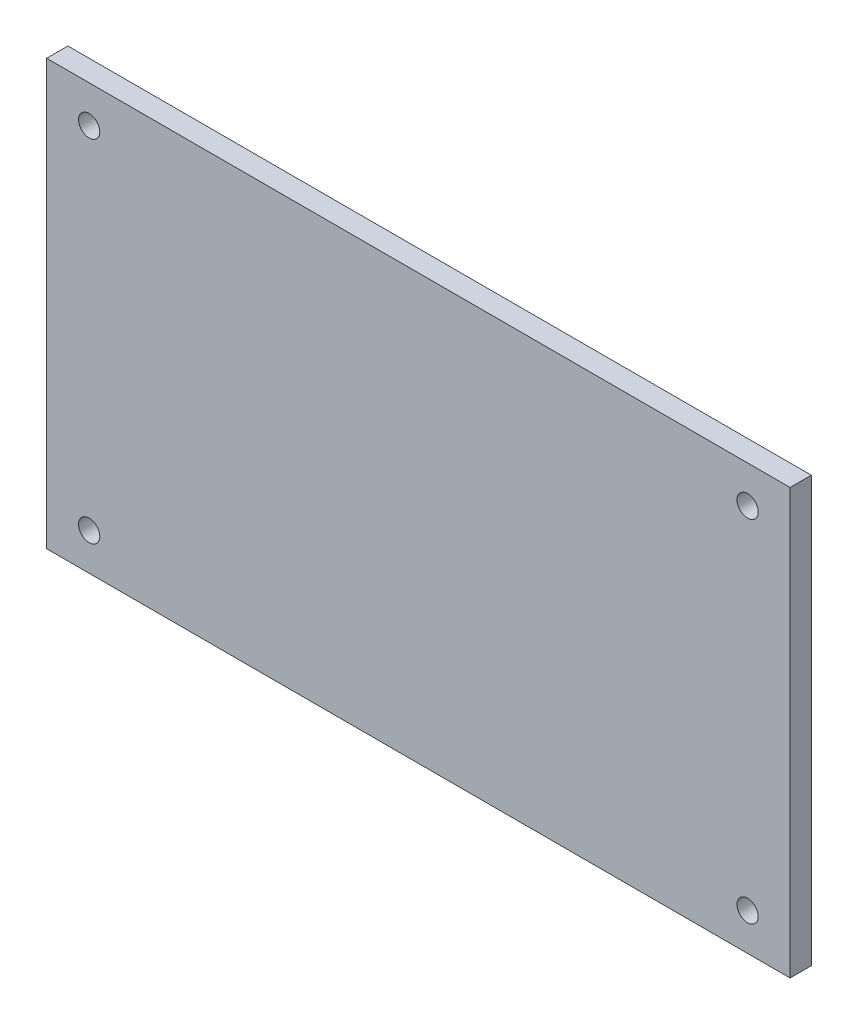
ISO-10303-21;
HEADER;
FILE_DESCRIPTION(('STEP AP214'),'2;1');
FILE_NAME('part.step','',(''),(''),'','','');
FILE_SCHEMA(('AUTOMOTIVE_DESIGN { 1 0 10303 214 1 1 1 1 }'));
ENDSEC;
DATA;
#1=APPLICATION_CONTEXT('core data for automotive mechanical design processes');
#2=APPLICATION_PROTOCOL_DEFINITION('international standard','automotive_design',2000,#1);
#3=PRODUCT_CONTEXT('',#1,'mechanical');
#4=PRODUCT('Part','Part','',(#3));
#5=PRODUCT_RELATED_PRODUCT_CATEGORY('part','',(#4));
#6=PRODUCT_DEFINITION_FORMATION('','',#4);
#7=PRODUCT_DEFINITION_CONTEXT('part definition',#1,'design');
#8=PRODUCT_DEFINITION('design','',#6,#7);
#9=PRODUCT_DEFINITION_SHAPE('','',#8);
#10=(LENGTH_UNIT() NAMED_UNIT(*) SI_UNIT(.MILLI.,.METRE.));
#11=(NAMED_UNIT(*) PLANE_ANGLE_UNIT() SI_UNIT($,.RADIAN.));
#12=(NAMED_UNIT(*) SI_UNIT($,.STERADIAN.) SOLID_ANGLE_UNIT());
#13=UNCERTAINTY_MEASURE_WITH_UNIT(LENGTH_MEASURE(1.E-05),#10,'distance_accuracy_value','');
#14=(GEOMETRIC_REPRESENTATION_CONTEXT(3) GLOBAL_UNCERTAINTY_ASSIGNED_CONTEXT((#13)) GLOBAL_UNIT_ASSIGNED_CONTEXT((#10,
#11,#12)) REPRESENTATION_CONTEXT('',''));
#15=CARTESIAN_POINT('',(0.,0.,0.));
#16=DIRECTION('',(0.,0.,1.));
#17=DIRECTION('',(1.,0.,0.));
#18=AXIS2_PLACEMENT_3D('',#15,#16,#17);
#19=CARTESIAN_POINT('',(52.5,30.,3.));
#20=DIRECTION('',(-1.,0.,0.));
#21=DIRECTION('',(0.,-1.,0.));
#22=AXIS2_PLACEMENT_3D('',#19,#20,#21);
#23=PLANE('',#22);
#24=DIRECTION('',(0.,1.,0.));
#25=VECTOR('',#24,1.);
#26=CARTESIAN_POINT('',(52.5,30.,0.));
#27=LINE('',#26,#25);
#28=CARTESIAN_POINT('',(52.5,-30.,0.));
#29=VERTEX_POINT('',#28);
#30=CARTESIAN_POINT('',(52.5,30.,0.));
#31=VERTEX_POINT('',#30);
#32=EDGE_CURVE('E95',#29,#31,#27,.T.);
#33=ORIENTED_EDGE('',*,*,#32,.T.);
#34=DIRECTION('',(0.,0.,-1.));
#35=VECTOR('',#34,1.);
#36=CARTESIAN_POINT('',(52.5,30.,3.));
#37=LINE('',#36,#35);
#38=CARTESIAN_POINT('',(52.5,30.,3.));
#39=VERTEX_POINT('',#38);
#40=EDGE_CURVE('E11',#39,#31,#37,.T.);
#41=ORIENTED_EDGE('',*,*,#40,.F.);
#42=DIRECTION('',(0.,1.,0.));
#43=VECTOR('',#42,1.);
#44=CARTESIAN_POINT('',(52.5,30.,3.));
#45=LINE('',#44,#43);
#46=CARTESIAN_POINT('',(52.5,-30.,3.));
#47=VERTEX_POINT('',#46);
#48=EDGE_CURVE('E83',#47,#39,#45,.T.);
#49=ORIENTED_EDGE('',*,*,#48,.F.);
#50=DIRECTION('',(0.,0.,-1.));
#51=VECTOR('',#50,1.);
#52=CARTESIAN_POINT('',(52.5,-30.,3.));
#53=LINE('',#52,#51);
#54=EDGE_CURVE('E91',#47,#29,#53,.T.);
#55=ORIENTED_EDGE('',*,*,#54,.T.);
#56=EDGE_LOOP('',(#33,#41,#49,#55));
#57=FACE_BOUND('',#56,.T.);
#58=ADVANCED_FACE('F32',(#57),#23,.F.);
#59=CARTESIAN_POINT('',(-52.5,30.,3.));
#60=DIRECTION('',(0.,-1.,0.));
#61=DIRECTION('',(0.,0.,-1.));
#62=AXIS2_PLACEMENT_3D('',#59,#60,#61);
#63=PLANE('',#62);
#64=DIRECTION('',(-1.,0.,0.));
#65=VECTOR('',#64,1.);
#66=CARTESIAN_POINT('',(-52.5,30.,0.));
#67=LINE('',#66,#65);
#68=CARTESIAN_POINT('',(-52.5,30.,0.));
#69=VERTEX_POINT('',#68);
#70=EDGE_CURVE('E87',#31,#69,#67,.T.);
#71=ORIENTED_EDGE('',*,*,#70,.T.);
#72=DIRECTION('',(0.,0.,-1.));
#73=VECTOR('',#72,1.);
#74=CARTESIAN_POINT('',(-52.5,30.,3.));
#75=LINE('',#74,#73);
#76=CARTESIAN_POINT('',(-52.5,30.,3.));
#77=VERTEX_POINT('',#76);
#78=EDGE_CURVE('E40',#77,#69,#75,.T.);
#79=ORIENTED_EDGE('',*,*,#78,.F.);
#80=DIRECTION('',(-1.,0.,0.));
#81=VECTOR('',#80,1.);
#82=CARTESIAN_POINT('',(-52.5,30.,3.));
#83=LINE('',#82,#81);
#84=EDGE_CURVE('E78',#39,#77,#83,.T.);
#85=ORIENTED_EDGE('',*,*,#84,.F.);
#86=ORIENTED_EDGE('',*,*,#40,.T.);
#87=EDGE_LOOP('',(#71,#79,#85,#86));
#88=FACE_BOUND('',#87,.T.);
#89=ADVANCED_FACE('F86',(#88),#63,.F.);
#90=CARTESIAN_POINT('',(-52.5,30.,3.));
#91=DIRECTION('',(1.,0.,0.));
#92=DIRECTION('',(0.,1.,0.));
#93=AXIS2_PLACEMENT_3D('',#90,#91,#92);
#94=PLANE('',#93);
#95=DIRECTION('',(0.,-1.,0.));
#96=VECTOR('',#95,1.);
#97=CARTESIAN_POINT('',(-52.5,30.,0.));
#98=LINE('',#97,#96);
#99=CARTESIAN_POINT('',(-52.5,-30.,0.));
#100=VERTEX_POINT('',#99);
#101=EDGE_CURVE('E65',#69,#100,#98,.T.);
#102=ORIENTED_EDGE('',*,*,#101,.T.);
#103=DIRECTION('',(0.,0.,-1.));
#104=VECTOR('',#103,1.);
#105=CARTESIAN_POINT('',(-52.5,-30.,3.));
#106=LINE('',#105,#104);
#107=CARTESIAN_POINT('',(-52.5,-30.,3.));
#108=VERTEX_POINT('',#107);
#109=EDGE_CURVE('E88',#108,#100,#106,.T.);
#110=ORIENTED_EDGE('',*,*,#109,.F.);
#111=DIRECTION('',(0.,-1.,0.));
#112=VECTOR('',#111,1.);
#113=CARTESIAN_POINT('',(-52.5,30.,3.));
#114=LINE('',#113,#112);
#115=EDGE_CURVE('E81',#77,#108,#114,.T.);
#116=ORIENTED_EDGE('',*,*,#115,.F.);
#117=ORIENTED_EDGE('',*,*,#78,.T.);
#118=EDGE_LOOP('',(#102,#110,#116,#117));
#119=FACE_BOUND('',#118,.T.);
#120=ADVANCED_FACE('F89',(#119),#94,.F.);
#121=CARTESIAN_POINT('',(-52.5,-30.,3.));
#122=DIRECTION('',(0.,1.,0.));
#123=DIRECTION('',(0.,0.,1.));
#124=AXIS2_PLACEMENT_3D('',#121,#122,#123);
#125=PLANE('',#124);
#126=DIRECTION('',(1.,0.,0.));
#127=VECTOR('',#126,1.);
#128=CARTESIAN_POINT('',(-52.5,-30.,0.));
#129=LINE('',#128,#127);
#130=EDGE_CURVE('E71',#100,#29,#129,.T.);
#131=ORIENTED_EDGE('',*,*,#130,.T.);
#132=ORIENTED_EDGE('',*,*,#54,.F.);
#133=DIRECTION('',(1.,0.,0.));
#134=VECTOR('',#133,1.);
#135=CARTESIAN_POINT('',(-52.5,-30.,3.));
#136=LINE('',#135,#134);
#137=EDGE_CURVE('E48',#108,#47,#136,.T.);
#138=ORIENTED_EDGE('',*,*,#137,.F.);
#139=ORIENTED_EDGE('',*,*,#109,.T.);
#140=EDGE_LOOP('',(#131,#132,#138,#139));
#141=FACE_BOUND('',#140,.T.);
#142=ADVANCED_FACE('F103',(#141),#125,.F.);
#143=CARTESIAN_POINT('',(0.,0.,3.));
#144=DIRECTION('',(0.,0.,1.));
#145=DIRECTION('',(1.,0.,0.));
#146=AXIS2_PLACEMENT_3D('',#143,#144,#145);
#147=PLANE('',#146);
#148=CARTESIAN_POINT('',(46.5000000000001,-24.75,3.));
#149=DIRECTION('',(0.,0.,-1.));
#150=DIRECTION('',(-1.,0.,0.));
#151=AXIS2_PLACEMENT_3D('',#148,#149,#150);
#152=CIRCLE('',#151,1.5);
#153=CARTESIAN_POINT('',(45.0000000000001,-24.75,3.));
#154=VERTEX_POINT('',#153);
#155=EDGE_CURVE('E112',#154,#154,#152,.T.);
#156=ORIENTED_EDGE('',*,*,#155,.T.);
#157=EDGE_LOOP('',(#156));
#158=FACE_BOUND('',#157,.T.);
#159=CARTESIAN_POINT('',(-46.5,-24.75,3.));
#160=DIRECTION('',(0.,0.,-1.));
#161=DIRECTION('',(-1.,0.,0.));
#162=AXIS2_PLACEMENT_3D('',#159,#160,#161);
#163=CIRCLE('',#162,1.5);
#164=CARTESIAN_POINT('',(-48.,-24.75,3.));
#165=VERTEX_POINT('',#164);
#166=EDGE_CURVE('E124',#165,#165,#163,.T.);
#167=ORIENTED_EDGE('',*,*,#166,.T.);
#168=EDGE_LOOP('',(#167));
#169=FACE_BOUND('',#168,.T.);
#170=CARTESIAN_POINT('',(-46.5,24.75,3.));
#171=DIRECTION('',(0.,0.,-1.));
#172=DIRECTION('',(-1.,0.,0.));
#173=AXIS2_PLACEMENT_3D('',#170,#171,#172);
#174=CIRCLE('',#173,1.5);
#175=CARTESIAN_POINT('',(-48.,24.75,3.));
#176=VERTEX_POINT('',#175);
#177=EDGE_CURVE('E118',#176,#176,#174,.T.);
#178=ORIENTED_EDGE('',*,*,#177,.T.);
#179=EDGE_LOOP('',(#178));
#180=FACE_BOUND('',#179,.T.);
#181=CARTESIAN_POINT('',(46.5000000000001,24.75,3.));
#182=DIRECTION('',(0.,0.,-1.));
#183=DIRECTION('',(-1.,0.,0.));
#184=AXIS2_PLACEMENT_3D('',#181,#182,#183);
#185=CIRCLE('',#184,1.5);
#186=CARTESIAN_POINT('',(45.0000000000001,24.75,3.));
#187=VERTEX_POINT('',#186);
#188=EDGE_CURVE('E98',#187,#187,#185,.T.);
#189=ORIENTED_EDGE('',*,*,#188,.T.);
#190=EDGE_LOOP('',(#189));
#191=FACE_BOUND('',#190,.T.);
#192=ORIENTED_EDGE('',*,*,#48,.T.);
#193=ORIENTED_EDGE('',*,*,#84,.T.);
#194=ORIENTED_EDGE('',*,*,#115,.T.);
#195=ORIENTED_EDGE('',*,*,#137,.T.);
#196=EDGE_LOOP('',(#192,#193,#194,#195));
#197=FACE_BOUND('',#196,.T.);
#198=ADVANCED_FACE('F79',(#158,#169,#180,#191,#197),#147,.T.);
#199=CARTESIAN_POINT('',(0.,0.,0.));
#200=DIRECTION('',(0.,0.,1.));
#201=DIRECTION('',(1.,0.,0.));
#202=AXIS2_PLACEMENT_3D('',#199,#200,#201);
#203=PLANE('',#202);
#204=CARTESIAN_POINT('',(46.5000000000001,-24.75,0.));
#205=DIRECTION('',(0.,0.,-1.));
#206=DIRECTION('',(-1.,0.,0.));
#207=AXIS2_PLACEMENT_3D('',#204,#205,#206);
#208=CIRCLE('',#207,1.5);
#209=CARTESIAN_POINT('',(45.0000000000001,-24.75,0.));
#210=VERTEX_POINT('',#209);
#211=EDGE_CURVE('E127',#210,#210,#208,.T.);
#212=ORIENTED_EDGE('',*,*,#211,.F.);
#213=EDGE_LOOP('',(#212));
#214=FACE_BOUND('',#213,.T.);
#215=CARTESIAN_POINT('',(-46.5,-24.75,0.));
#216=DIRECTION('',(0.,0.,-1.));
#217=DIRECTION('',(-1.,0.,0.));
#218=AXIS2_PLACEMENT_3D('',#215,#216,#217);
#219=CIRCLE('',#218,1.5);
#220=CARTESIAN_POINT('',(-48.,-24.75,0.));
#221=VERTEX_POINT('',#220);
#222=EDGE_CURVE('E121',#221,#221,#219,.T.);
#223=ORIENTED_EDGE('',*,*,#222,.F.);
#224=EDGE_LOOP('',(#223));
#225=FACE_BOUND('',#224,.T.);
#226=CARTESIAN_POINT('',(-46.5,24.75,0.));
#227=DIRECTION('',(0.,0.,-1.));
#228=DIRECTION('',(-1.,0.,0.));
#229=AXIS2_PLACEMENT_3D('',#226,#227,#228);
#230=CIRCLE('',#229,1.5);
#231=CARTESIAN_POINT('',(-48.,24.75,0.));
#232=VERTEX_POINT('',#231);
#233=EDGE_CURVE('E115',#232,#232,#230,.T.);
#234=ORIENTED_EDGE('',*,*,#233,.F.);
#235=EDGE_LOOP('',(#234));
#236=FACE_BOUND('',#235,.T.);
#237=CARTESIAN_POINT('',(46.5000000000001,24.75,0.));
#238=DIRECTION('',(0.,0.,-1.));
#239=DIRECTION('',(-1.,0.,0.));
#240=AXIS2_PLACEMENT_3D('',#237,#238,#239);
#241=CIRCLE('',#240,1.5);
#242=CARTESIAN_POINT('',(45.0000000000001,24.75,0.));
#243=VERTEX_POINT('',#242);
#244=EDGE_CURVE('E109',#243,#243,#241,.T.);
#245=ORIENTED_EDGE('',*,*,#244,.F.);
#246=EDGE_LOOP('',(#245));
#247=FACE_BOUND('',#246,.T.);
#248=ORIENTED_EDGE('',*,*,#32,.F.);
#249=ORIENTED_EDGE('',*,*,#130,.F.);
#250=ORIENTED_EDGE('',*,*,#101,.F.);
#251=ORIENTED_EDGE('',*,*,#70,.F.);
#252=EDGE_LOOP('',(#248,#249,#250,#251));
#253=FACE_BOUND('',#252,.T.);
#254=ADVANCED_FACE('F106',(#214,#225,#236,#247,#253),#203,.F.);
#255=CARTESIAN_POINT('',(46.5000000000001,24.75,3.));
#256=DIRECTION('',(0.,0.,-1.));
#257=DIRECTION('',(-1.,0.,0.));
#258=AXIS2_PLACEMENT_3D('',#255,#256,#257);
#259=CYLINDRICAL_SURFACE('',#258,1.5);
#260=ORIENTED_EDGE('',*,*,#188,.F.);
#261=EDGE_LOOP('',(#260));
#262=FACE_BOUND('',#261,.T.);
#263=ORIENTED_EDGE('',*,*,#244,.T.);
#264=EDGE_LOOP('',(#263));
#265=FACE_BOUND('',#264,.T.);
#266=ADVANCED_FACE('F144',(#262,#265),#259,.F.);
#267=CARTESIAN_POINT('',(-46.5,24.75,3.));
#268=DIRECTION('',(0.,0.,-1.));
#269=DIRECTION('',(-1.,0.,0.));
#270=AXIS2_PLACEMENT_3D('',#267,#268,#269);
#271=CYLINDRICAL_SURFACE('',#270,1.5);
#272=ORIENTED_EDGE('',*,*,#177,.F.);
#273=EDGE_LOOP('',(#272));
#274=FACE_BOUND('',#273,.T.);
#275=ORIENTED_EDGE('',*,*,#233,.T.);
#276=EDGE_LOOP('',(#275));
#277=FACE_BOUND('',#276,.T.);
#278=ADVANCED_FACE('F153',(#274,#277),#271,.F.);
#279=CARTESIAN_POINT('',(-46.5,-24.75,3.));
#280=DIRECTION('',(0.,0.,-1.));
#281=DIRECTION('',(-1.,0.,0.));
#282=AXIS2_PLACEMENT_3D('',#279,#280,#281);
#283=CYLINDRICAL_SURFACE('',#282,1.5);
#284=ORIENTED_EDGE('',*,*,#166,.F.);
#285=EDGE_LOOP('',(#284));
#286=FACE_BOUND('',#285,.T.);
#287=ORIENTED_EDGE('',*,*,#222,.T.);
#288=EDGE_LOOP('',(#287));
#289=FACE_BOUND('',#288,.T.);
#290=ADVANCED_FACE('F138',(#286,#289),#283,.F.);
#291=CARTESIAN_POINT('',(46.5000000000001,-24.75,3.));
#292=DIRECTION('',(0.,0.,-1.));
#293=DIRECTION('',(-1.,0.,0.));
#294=AXIS2_PLACEMENT_3D('',#291,#292,#293);
#295=CYLINDRICAL_SURFACE('',#294,1.5);
#296=ORIENTED_EDGE('',*,*,#155,.F.);
#297=EDGE_LOOP('',(#296));
#298=FACE_BOUND('',#297,.T.);
#299=ORIENTED_EDGE('',*,*,#211,.T.);
#300=EDGE_LOOP('',(#299));
#301=FACE_BOUND('',#300,.T.);
#302=ADVANCED_FACE('F135',(#298,#301),#295,.F.);
#303=CLOSED_SHELL('',(#58,#89,#120,#142,#198,#254,#266,#278,#290,#302));
#304=MANIFOLD_SOLID_BREP('B2',#303);
#305=ADVANCED_BREP_SHAPE_REPRESENTATION('',(#18,#304),#14);
#306=SHAPE_DEFINITION_REPRESENTATION(#9,#305);
ENDSEC;
END-ISO-10303-21;
